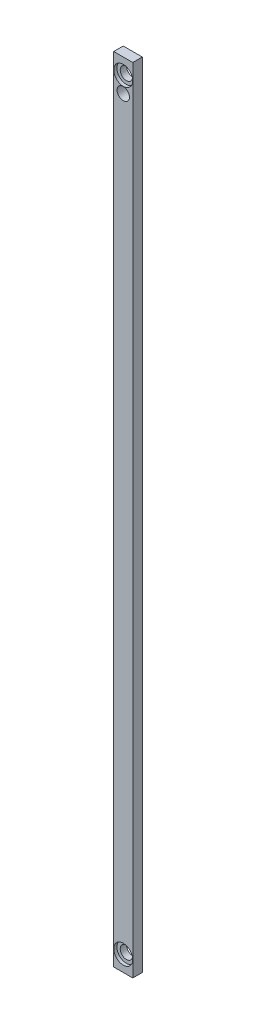
ISO-10303-21;
HEADER;
FILE_DESCRIPTION(('STEP AP214'),'2;1');
FILE_NAME('part.step','',(''),(''),'','','');
FILE_SCHEMA(('AUTOMOTIVE_DESIGN { 1 0 10303 214 1 1 1 1 }'));
ENDSEC;
DATA;
#1=APPLICATION_CONTEXT('core data for automotive mechanical design processes');
#2=APPLICATION_PROTOCOL_DEFINITION('international standard','automotive_design',2000,#1);
#3=PRODUCT_CONTEXT('',#1,'mechanical');
#4=PRODUCT('Part','Part','',(#3));
#5=PRODUCT_RELATED_PRODUCT_CATEGORY('part','',(#4));
#6=PRODUCT_DEFINITION_FORMATION('','',#4);
#7=PRODUCT_DEFINITION_CONTEXT('part definition',#1,'design');
#8=PRODUCT_DEFINITION('design','',#6,#7);
#9=PRODUCT_DEFINITION_SHAPE('','',#8);
#10=(LENGTH_UNIT() NAMED_UNIT(*) SI_UNIT(.MILLI.,.METRE.));
#11=(NAMED_UNIT(*) PLANE_ANGLE_UNIT() SI_UNIT($,.RADIAN.));
#12=(NAMED_UNIT(*) SI_UNIT($,.STERADIAN.) SOLID_ANGLE_UNIT());
#13=UNCERTAINTY_MEASURE_WITH_UNIT(LENGTH_MEASURE(1.E-05),#10,'distance_accuracy_value','');
#14=(GEOMETRIC_REPRESENTATION_CONTEXT(3) GLOBAL_UNCERTAINTY_ASSIGNED_CONTEXT((#13)) GLOBAL_UNIT_ASSIGNED_CONTEXT((#10,
#11,#12)) REPRESENTATION_CONTEXT('',''));
#15=CARTESIAN_POINT('',(0.,0.,0.));
#16=DIRECTION('',(0.,0.,1.));
#17=DIRECTION('',(1.,0.,0.));
#18=AXIS2_PLACEMENT_3D('',#15,#16,#17);
#19=CARTESIAN_POINT('',(-3.,245.,0.));
#20=DIRECTION('',(0.,0.,1.));
#21=DIRECTION('',(1.,0.,0.));
#22=AXIS2_PLACEMENT_3D('',#19,#20,#21);
#23=CYLINDRICAL_SURFACE('',#22,1.95);
#24=CARTESIAN_POINT('',(-3.,245.,0.));
#25=DIRECTION('',(0.,0.,1.));
#26=DIRECTION('',(1.,0.,0.));
#27=AXIS2_PLACEMENT_3D('',#24,#25,#26);
#28=CIRCLE('',#27,1.95);
#29=CARTESIAN_POINT('',(-1.05,245.,0.));
#30=VERTEX_POINT('',#29);
#31=EDGE_CURVE('E103',#30,#30,#28,.T.);
#32=ORIENTED_EDGE('',*,*,#31,.F.);
#33=EDGE_LOOP('',(#32));
#34=FACE_BOUND('',#33,.T.);
#35=CARTESIAN_POINT('',(-3.,245.,2.));
#36=DIRECTION('',(0.,0.,1.));
#37=DIRECTION('',(1.,0.,0.));
#38=AXIS2_PLACEMENT_3D('',#35,#36,#37);
#39=CIRCLE('',#38,1.95);
#40=CARTESIAN_POINT('',(-1.05,245.,2.));
#41=VERTEX_POINT('',#40);
#42=EDGE_CURVE('E37',#41,#41,#39,.F.);
#43=ORIENTED_EDGE('',*,*,#42,.F.);
#44=EDGE_LOOP('',(#43));
#45=FACE_BOUND('',#44,.T.);
#46=ADVANCED_FACE('F33',(#34,#45),#23,.F.);
#47=CARTESIAN_POINT('',(-3.,5.,0.));
#48=DIRECTION('',(0.,0.,1.));
#49=DIRECTION('',(1.,0.,0.));
#50=AXIS2_PLACEMENT_3D('',#47,#48,#49);
#51=CYLINDRICAL_SURFACE('',#50,1.95);
#52=CARTESIAN_POINT('',(-3.,5.,0.));
#53=DIRECTION('',(0.,0.,1.));
#54=DIRECTION('',(1.,0.,0.));
#55=AXIS2_PLACEMENT_3D('',#52,#53,#54);
#56=CIRCLE('',#55,1.95);
#57=CARTESIAN_POINT('',(-1.05,5.,0.));
#58=VERTEX_POINT('',#57);
#59=EDGE_CURVE('E110',#58,#58,#56,.T.);
#60=ORIENTED_EDGE('',*,*,#59,.F.);
#61=EDGE_LOOP('',(#60));
#62=FACE_BOUND('',#61,.T.);
#63=CARTESIAN_POINT('',(-3.,5.,2.));
#64=DIRECTION('',(0.,0.,1.));
#65=DIRECTION('',(1.,0.,0.));
#66=AXIS2_PLACEMENT_3D('',#63,#64,#65);
#67=CIRCLE('',#66,1.95);
#68=CARTESIAN_POINT('',(-1.05,5.,2.));
#69=VERTEX_POINT('',#68);
#70=EDGE_CURVE('E108',#69,#69,#67,.F.);
#71=ORIENTED_EDGE('',*,*,#70,.F.);
#72=EDGE_LOOP('',(#71));
#73=FACE_BOUND('',#72,.T.);
#74=ADVANCED_FACE('F141',(#62,#73),#51,.F.);
#75=CARTESIAN_POINT('',(0.,0.,3.));
#76=DIRECTION('',(-1.,0.,0.));
#77=DIRECTION('',(0.,-1.,0.));
#78=AXIS2_PLACEMENT_3D('',#75,#76,#77);
#79=PLANE('',#78);
#80=DIRECTION('',(0.,1.,0.));
#81=VECTOR('',#80,1.);
#82=CARTESIAN_POINT('',(0.,0.,0.));
#83=LINE('',#82,#81);
#84=CARTESIAN_POINT('',(0.,0.,0.));
#85=VERTEX_POINT('',#84);
#86=CARTESIAN_POINT('',(0.,250.,0.));
#87=VERTEX_POINT('',#86);
#88=EDGE_CURVE('E100',#85,#87,#83,.T.);
#89=ORIENTED_EDGE('',*,*,#88,.T.);
#90=DIRECTION('',(0.,0.,-1.));
#91=VECTOR('',#90,1.);
#92=CARTESIAN_POINT('',(0.,250.,3.));
#93=LINE('',#92,#91);
#94=CARTESIAN_POINT('',(0.,250.,3.));
#95=VERTEX_POINT('',#94);
#96=EDGE_CURVE('E11',#95,#87,#93,.T.);
#97=ORIENTED_EDGE('',*,*,#96,.F.);
#98=DIRECTION('',(0.,1.,0.));
#99=VECTOR('',#98,1.);
#100=CARTESIAN_POINT('',(0.,0.,3.));
#101=LINE('',#100,#99);
#102=CARTESIAN_POINT('',(0.,0.,3.));
#103=VERTEX_POINT('',#102);
#104=EDGE_CURVE('E87',#103,#95,#101,.T.);
#105=ORIENTED_EDGE('',*,*,#104,.F.);
#106=DIRECTION('',(0.,0.,-1.));
#107=VECTOR('',#106,1.);
#108=CARTESIAN_POINT('',(0.,0.,3.));
#109=LINE('',#108,#107);
#110=EDGE_CURVE('E96',#103,#85,#109,.T.);
#111=ORIENTED_EDGE('',*,*,#110,.T.);
#112=EDGE_LOOP('',(#89,#97,#105,#111));
#113=FACE_BOUND('',#112,.T.);
#114=ADVANCED_FACE('F35',(#113),#79,.F.);
#115=CARTESIAN_POINT('',(0.,250.,3.));
#116=DIRECTION('',(0.,-1.,0.));
#117=DIRECTION('',(0.,0.,-1.));
#118=AXIS2_PLACEMENT_3D('',#115,#116,#117);
#119=PLANE('',#118);
#120=DIRECTION('',(-1.,0.,0.));
#121=VECTOR('',#120,1.);
#122=CARTESIAN_POINT('',(0.,250.,0.));
#123=LINE('',#122,#121);
#124=CARTESIAN_POINT('',(-5.99999999999998,250.,0.));
#125=VERTEX_POINT('',#124);
#126=EDGE_CURVE('E91',#87,#125,#123,.T.);
#127=ORIENTED_EDGE('',*,*,#126,.T.);
#128=DIRECTION('',(0.,0.,-1.));
#129=VECTOR('',#128,1.);
#130=CARTESIAN_POINT('',(-5.99999999999998,250.,3.));
#131=LINE('',#130,#129);
#132=CARTESIAN_POINT('',(-5.99999999999998,250.,3.));
#133=VERTEX_POINT('',#132);
#134=EDGE_CURVE('E43',#133,#125,#131,.T.);
#135=ORIENTED_EDGE('',*,*,#134,.F.);
#136=DIRECTION('',(-1.,0.,0.));
#137=VECTOR('',#136,1.);
#138=CARTESIAN_POINT('',(0.,250.,3.));
#139=LINE('',#138,#137);
#140=EDGE_CURVE('E82',#95,#133,#139,.T.);
#141=ORIENTED_EDGE('',*,*,#140,.F.);
#142=ORIENTED_EDGE('',*,*,#96,.T.);
#143=EDGE_LOOP('',(#127,#135,#141,#142));
#144=FACE_BOUND('',#143,.T.);
#145=ADVANCED_FACE('F90',(#144),#119,.F.);
#146=CARTESIAN_POINT('',(-6.,0.,3.));
#147=DIRECTION('',(1.,0.,0.));
#148=DIRECTION('',(0.,1.,0.));
#149=AXIS2_PLACEMENT_3D('',#146,#147,#148);
#150=PLANE('',#149);
#151=DIRECTION('',(0.,-1.,0.));
#152=VECTOR('',#151,1.);
#153=CARTESIAN_POINT('',(-6.,0.,0.));
#154=LINE('',#153,#152);
#155=CARTESIAN_POINT('',(-6.,0.,0.));
#156=VERTEX_POINT('',#155);
#157=EDGE_CURVE('E69',#125,#156,#154,.T.);
#158=ORIENTED_EDGE('',*,*,#157,.T.);
#159=DIRECTION('',(0.,0.,-1.));
#160=VECTOR('',#159,1.);
#161=CARTESIAN_POINT('',(-6.,0.,3.));
#162=LINE('',#161,#160);
#163=CARTESIAN_POINT('',(-6.,0.,3.));
#164=VERTEX_POINT('',#163);
#165=EDGE_CURVE('E92',#164,#156,#162,.T.);
#166=ORIENTED_EDGE('',*,*,#165,.F.);
#167=DIRECTION('',(0.,-1.,0.));
#168=VECTOR('',#167,1.);
#169=CARTESIAN_POINT('',(-6.,0.,3.));
#170=LINE('',#169,#168);
#171=EDGE_CURVE('E85',#133,#164,#170,.T.);
#172=ORIENTED_EDGE('',*,*,#171,.F.);
#173=ORIENTED_EDGE('',*,*,#134,.T.);
#174=EDGE_LOOP('',(#158,#166,#172,#173));
#175=FACE_BOUND('',#174,.T.);
#176=ADVANCED_FACE('F94',(#175),#150,.F.);
#177=CARTESIAN_POINT('',(0.,0.,3.));
#178=DIRECTION('',(0.,1.,0.));
#179=DIRECTION('',(-1.,0.,0.));
#180=AXIS2_PLACEMENT_3D('',#177,#178,#179);
#181=PLANE('',#180);
#182=DIRECTION('',(1.,0.,0.));
#183=VECTOR('',#182,1.);
#184=CARTESIAN_POINT('',(0.,0.,0.));
#185=LINE('',#184,#183);
#186=EDGE_CURVE('E75',#156,#85,#185,.T.);
#187=ORIENTED_EDGE('',*,*,#186,.T.);
#188=ORIENTED_EDGE('',*,*,#110,.F.);
#189=DIRECTION('',(1.,0.,0.));
#190=VECTOR('',#189,1.);
#191=CARTESIAN_POINT('',(0.,0.,3.));
#192=LINE('',#191,#190);
#193=EDGE_CURVE('E52',#164,#103,#192,.T.);
#194=ORIENTED_EDGE('',*,*,#193,.F.);
#195=ORIENTED_EDGE('',*,*,#165,.T.);
#196=EDGE_LOOP('',(#187,#188,#194,#195));
#197=FACE_BOUND('',#196,.T.);
#198=ADVANCED_FACE('F157',(#197),#181,.F.);
#199=CARTESIAN_POINT('',(0.,0.,3.));
#200=DIRECTION('',(0.,0.,1.));
#201=DIRECTION('',(1.,0.,0.));
#202=AXIS2_PLACEMENT_3D('',#199,#200,#201);
#203=PLANE('',#202);
#204=CARTESIAN_POINT('',(-3.,245.,3.));
#205=DIRECTION('',(0.,0.,1.));
#206=DIRECTION('',(1.,0.,0.));
#207=AXIS2_PLACEMENT_3D('',#204,#205,#206);
#208=CIRCLE('',#207,2.995);
#209=CARTESIAN_POINT('',(-0.0049999999999998,245.,3.));
#210=VERTEX_POINT('',#209);
#211=EDGE_CURVE('E125',#210,#210,#208,.T.);
#212=ORIENTED_EDGE('',*,*,#211,.F.);
#213=EDGE_LOOP('',(#212));
#214=FACE_BOUND('',#213,.T.);
#215=CARTESIAN_POINT('',(-3.,5.,3.));
#216=DIRECTION('',(0.,0.,1.));
#217=DIRECTION('',(1.,0.,0.));
#218=AXIS2_PLACEMENT_3D('',#215,#216,#217);
#219=CIRCLE('',#218,2.995);
#220=CARTESIAN_POINT('',(-0.00500000000000066,5.,3.));
#221=VERTEX_POINT('',#220);
#222=EDGE_CURVE('E118',#221,#221,#219,.T.);
#223=ORIENTED_EDGE('',*,*,#222,.F.);
#224=EDGE_LOOP('',(#223));
#225=FACE_BOUND('',#224,.T.);
#226=CARTESIAN_POINT('',(-3.,240.,3.));
#227=DIRECTION('',(0.,0.,1.));
#228=DIRECTION('',(1.,0.,0.));
#229=AXIS2_PLACEMENT_3D('',#226,#227,#228);
#230=CIRCLE('',#229,1.95);
#231=CARTESIAN_POINT('',(-1.05,240.,3.));
#232=VERTEX_POINT('',#231);
#233=EDGE_CURVE('E115',#232,#232,#230,.T.);
#234=ORIENTED_EDGE('',*,*,#233,.F.);
#235=EDGE_LOOP('',(#234));
#236=FACE_BOUND('',#235,.T.);
#237=ORIENTED_EDGE('',*,*,#104,.T.);
#238=ORIENTED_EDGE('',*,*,#140,.T.);
#239=ORIENTED_EDGE('',*,*,#171,.T.);
#240=ORIENTED_EDGE('',*,*,#193,.T.);
#241=EDGE_LOOP('',(#237,#238,#239,#240));
#242=FACE_BOUND('',#241,.T.);
#243=ADVANCED_FACE('F83',(#214,#225,#236,#242),#203,.T.);
#244=CARTESIAN_POINT('',(0.,0.,0.));
#245=DIRECTION('',(0.,0.,1.));
#246=DIRECTION('',(1.,0.,0.));
#247=AXIS2_PLACEMENT_3D('',#244,#245,#246);
#248=PLANE('',#247);
#249=ORIENTED_EDGE('',*,*,#59,.T.);
#250=EDGE_LOOP('',(#249));
#251=FACE_BOUND('',#250,.T.);
#252=CARTESIAN_POINT('',(-3.,240.,0.));
#253=DIRECTION('',(0.,0.,1.));
#254=DIRECTION('',(1.,0.,0.));
#255=AXIS2_PLACEMENT_3D('',#252,#253,#254);
#256=CIRCLE('',#255,1.95);
#257=CARTESIAN_POINT('',(-1.05,240.,0.));
#258=VERTEX_POINT('',#257);
#259=EDGE_CURVE('E128',#258,#258,#256,.T.);
#260=ORIENTED_EDGE('',*,*,#259,.T.);
#261=EDGE_LOOP('',(#260));
#262=FACE_BOUND('',#261,.T.);
#263=ORIENTED_EDGE('',*,*,#31,.T.);
#264=EDGE_LOOP('',(#263));
#265=FACE_BOUND('',#264,.T.);
#266=ORIENTED_EDGE('',*,*,#88,.F.);
#267=ORIENTED_EDGE('',*,*,#186,.F.);
#268=ORIENTED_EDGE('',*,*,#157,.F.);
#269=ORIENTED_EDGE('',*,*,#126,.F.);
#270=EDGE_LOOP('',(#266,#267,#268,#269));
#271=FACE_BOUND('',#270,.T.);
#272=ADVANCED_FACE('F136',(#251,#262,#265,#271),#248,.F.);
#273=CARTESIAN_POINT('',(-3.,240.,0.));
#274=DIRECTION('',(0.,0.,1.));
#275=DIRECTION('',(1.,0.,0.));
#276=AXIS2_PLACEMENT_3D('',#273,#274,#275);
#277=CYLINDRICAL_SURFACE('',#276,1.95);
#278=ORIENTED_EDGE('',*,*,#259,.F.);
#279=EDGE_LOOP('',(#278));
#280=FACE_BOUND('',#279,.T.);
#281=ORIENTED_EDGE('',*,*,#233,.T.);
#282=EDGE_LOOP('',(#281));
#283=FACE_BOUND('',#282,.T.);
#284=ADVANCED_FACE('F163',(#280,#283),#277,.F.);
#285=CARTESIAN_POINT('',(-3.,5.,2.));
#286=DIRECTION('',(0.,0.,1.));
#287=DIRECTION('',(1.,0.,0.));
#288=AXIS2_PLACEMENT_3D('',#285,#286,#287);
#289=PLANE('',#288);
#290=CARTESIAN_POINT('',(-3.,5.,2.));
#291=DIRECTION('',(0.,0.,1.));
#292=DIRECTION('',(1.,0.,0.));
#293=AXIS2_PLACEMENT_3D('',#290,#291,#292);
#294=CIRCLE('',#293,2.995);
#295=CARTESIAN_POINT('',(-0.00500000000000066,5.,2.));
#296=VERTEX_POINT('',#295);
#297=EDGE_CURVE('E111',#296,#296,#294,.T.);
#298=ORIENTED_EDGE('',*,*,#297,.T.);
#299=EDGE_LOOP('',(#298));
#300=FACE_BOUND('',#299,.T.);
#301=ORIENTED_EDGE('',*,*,#70,.T.);
#302=EDGE_LOOP('',(#301));
#303=FACE_BOUND('',#302,.T.);
#304=ADVANCED_FACE('F165',(#300,#303),#289,.T.);
#305=CARTESIAN_POINT('',(-3.,5.,2.));
#306=DIRECTION('',(0.,0.,1.));
#307=DIRECTION('',(1.,0.,0.));
#308=AXIS2_PLACEMENT_3D('',#305,#306,#307);
#309=CYLINDRICAL_SURFACE('',#308,2.995);
#310=ORIENTED_EDGE('',*,*,#297,.F.);
#311=EDGE_LOOP('',(#310));
#312=FACE_BOUND('',#311,.T.);
#313=ORIENTED_EDGE('',*,*,#222,.T.);
#314=EDGE_LOOP('',(#313));
#315=FACE_BOUND('',#314,.T.);
#316=ADVANCED_FACE('F173',(#312,#315),#309,.F.);
#317=CARTESIAN_POINT('',(-3.,245.,2.));
#318=DIRECTION('',(0.,0.,1.));
#319=DIRECTION('',(1.,0.,0.));
#320=AXIS2_PLACEMENT_3D('',#317,#318,#319);
#321=PLANE('',#320);
#322=CARTESIAN_POINT('',(-3.,245.,2.));
#323=DIRECTION('',(0.,0.,1.));
#324=DIRECTION('',(1.,0.,0.));
#325=AXIS2_PLACEMENT_3D('',#322,#323,#324);
#326=CIRCLE('',#325,2.995);
#327=CARTESIAN_POINT('',(-0.0049999999999998,245.,2.));
#328=VERTEX_POINT('',#327);
#329=EDGE_CURVE('E146',#328,#328,#326,.T.);
#330=ORIENTED_EDGE('',*,*,#329,.T.);
#331=EDGE_LOOP('',(#330));
#332=FACE_BOUND('',#331,.T.);
#333=ORIENTED_EDGE('',*,*,#42,.T.);
#334=EDGE_LOOP('',(#333));
#335=FACE_BOUND('',#334,.T.);
#336=ADVANCED_FACE('F220',(#332,#335),#321,.T.);
#337=CARTESIAN_POINT('',(-3.,245.,2.));
#338=DIRECTION('',(0.,0.,1.));
#339=DIRECTION('',(1.,0.,0.));
#340=AXIS2_PLACEMENT_3D('',#337,#338,#339);
#341=CYLINDRICAL_SURFACE('',#340,2.995);
#342=ORIENTED_EDGE('',*,*,#329,.F.);
#343=EDGE_LOOP('',(#342));
#344=FACE_BOUND('',#343,.T.);
#345=ORIENTED_EDGE('',*,*,#211,.T.);
#346=EDGE_LOOP('',(#345));
#347=FACE_BOUND('',#346,.T.);
#348=ADVANCED_FACE('F153',(#344,#347),#341,.F.);
#349=CLOSED_SHELL('',(#46,#74,#114,#145,#176,#198,#243,#272,#284,#304,#316,#336,#348));
#350=MANIFOLD_SOLID_BREP('B2',#349);
#351=ADVANCED_BREP_SHAPE_REPRESENTATION('',(#18,#350),#14);
#352=SHAPE_DEFINITION_REPRESENTATION(#9,#351);
ENDSEC;
END-ISO-10303-21;
